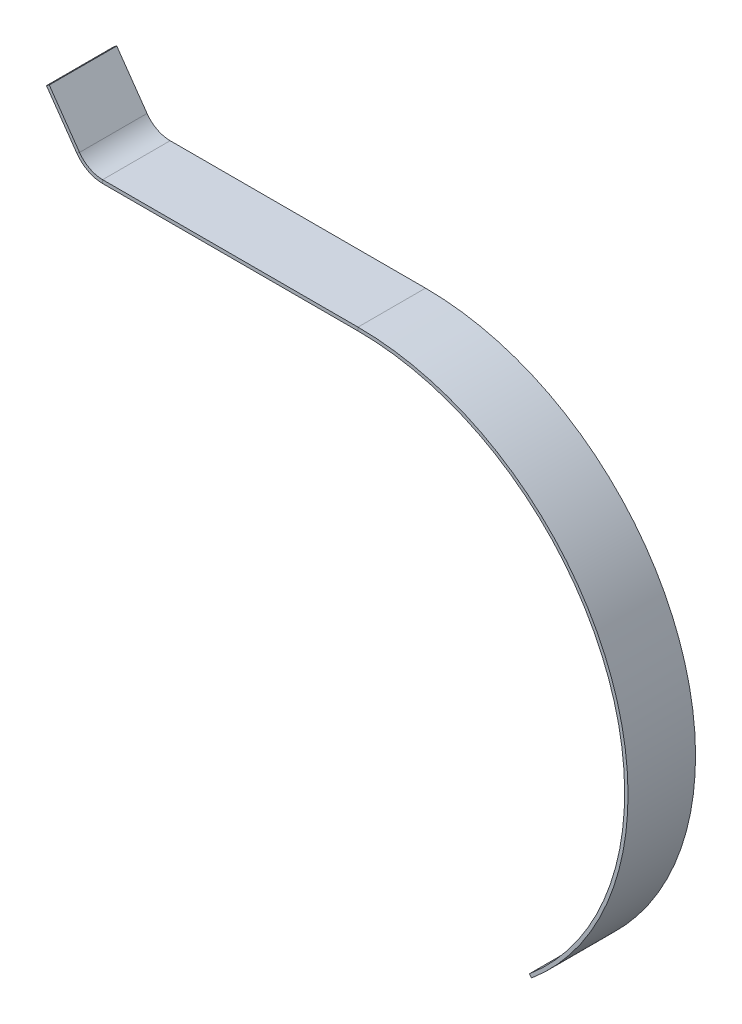
ISO-10303-21;
HEADER;
FILE_DESCRIPTION(('STEP AP214'),'2;1');
FILE_NAME('part.step','',(''),(''),'','','');
FILE_SCHEMA(('AUTOMOTIVE_DESIGN { 1 0 10303 214 1 1 1 1 }'));
ENDSEC;
DATA;
#1=APPLICATION_CONTEXT('core data for automotive mechanical design processes');
#2=APPLICATION_PROTOCOL_DEFINITION('international standard','automotive_design',2000,#1);
#3=PRODUCT_CONTEXT('',#1,'mechanical');
#4=PRODUCT('Part','Part','',(#3));
#5=PRODUCT_RELATED_PRODUCT_CATEGORY('part','',(#4));
#6=PRODUCT_DEFINITION_FORMATION('','',#4);
#7=PRODUCT_DEFINITION_CONTEXT('part definition',#1,'design');
#8=PRODUCT_DEFINITION('design','',#6,#7);
#9=PRODUCT_DEFINITION_SHAPE('','',#8);
#10=(LENGTH_UNIT() NAMED_UNIT(*) SI_UNIT(.MILLI.,.METRE.));
#11=(NAMED_UNIT(*) PLANE_ANGLE_UNIT() SI_UNIT($,.RADIAN.));
#12=(NAMED_UNIT(*) SI_UNIT($,.STERADIAN.) SOLID_ANGLE_UNIT());
#13=UNCERTAINTY_MEASURE_WITH_UNIT(LENGTH_MEASURE(1.E-05),#10,'distance_accuracy_value','');
#14=(GEOMETRIC_REPRESENTATION_CONTEXT(3) GLOBAL_UNCERTAINTY_ASSIGNED_CONTEXT((#13)) GLOBAL_UNIT_ASSIGNED_CONTEXT((#10,
#11,#12)) REPRESENTATION_CONTEXT('',''));
#15=CARTESIAN_POINT('',(0.,0.,0.));
#16=DIRECTION('',(0.,0.,1.));
#17=DIRECTION('',(1.,0.,0.));
#18=AXIS2_PLACEMENT_3D('',#15,#16,#17);
#19=CARTESIAN_POINT('',(9.14715287270209,-1.73830408857798,2.));
#20=DIRECTION('',(0.,0.,1.));
#21=DIRECTION('',(1.,0.,0.));
#22=AXIS2_PLACEMENT_3D('',#19,#20,#21);
#23=PLANE('',#22);
#24=DIRECTION('',(0.,1.,0.));
#25=VECTOR('',#24,1.);
#26=CARTESIAN_POINT('',(9.14715287270209,-1.73830408857798,2.));
#27=LINE('',#26,#25);
#28=CARTESIAN_POINT('',(9.14715287270209,-1.73830408857798,2.));
#29=VERTEX_POINT('',#28);
#30=CARTESIAN_POINT('',(9.14715287270209,-1.63830408857799,2.));
#31=VERTEX_POINT('',#30);
#32=EDGE_CURVE('E11',#29,#31,#27,.T.);
#33=ORIENTED_EDGE('',*,*,#32,.F.);
#34=CARTESIAN_POINT('',(9.14715287270209,-9.63830408857799,2.));
#35=DIRECTION('',(0.,0.,1.));
#36=DIRECTION('',(1.,0.,0.));
#37=AXIS2_PLACEMENT_3D('',#34,#35,#36);
#38=CIRCLE('',#37,7.9);
#39=CARTESIAN_POINT('',(14.2251749892257,-15.6900551892179,2.));
#40=VERTEX_POINT('',#39);
#41=EDGE_CURVE('E99',#29,#40,#38,.F.);
#42=ORIENTED_EDGE('',*,*,#41,.T.);
#43=DIRECTION('',(-0.642787609686561,0.76604444311896,0.));
#44=VECTOR('',#43,1.);
#45=CARTESIAN_POINT('',(14.2894537501944,-15.7666596335298,2.));
#46=LINE('',#45,#44);
#47=CARTESIAN_POINT('',(14.2894537501944,-15.7666596335298,2.));
#48=VERTEX_POINT('',#47);
#49=EDGE_CURVE('E430',#48,#40,#46,.T.);
#50=ORIENTED_EDGE('',*,*,#49,.F.);
#51=CARTESIAN_POINT('',(9.14715287270209,-9.63830408857799,2.));
#52=DIRECTION('',(0.,0.,-1.));
#53=DIRECTION('',(-1.,0.,0.));
#54=AXIS2_PLACEMENT_3D('',#51,#52,#53);
#55=CIRCLE('',#54,8.);
#56=EDGE_CURVE('E225',#31,#48,#55,.T.);
#57=ORIENTED_EDGE('',*,*,#56,.F.);
#58=EDGE_LOOP('',(#33,#42,#50,#57));
#59=FACE_BOUND('',#58,.T.);
#60=ADVANCED_FACE('F38',(#59),#23,.T.);
#61=CARTESIAN_POINT('',(9.14715287270209,-1.63830408857799,0.));
#62=DIRECTION('',(0.,0.,-1.));
#63=DIRECTION('',(-1.,0.,0.));
#64=AXIS2_PLACEMENT_3D('',#61,#62,#63);
#65=PLANE('',#64);
#66=DIRECTION('',(0.,-1.,0.));
#67=VECTOR('',#66,1.);
#68=CARTESIAN_POINT('',(9.14715287270209,-1.63830408857799,0.));
#69=LINE('',#68,#67);
#70=CARTESIAN_POINT('',(9.14715287270209,-1.63830408857799,0.));
#71=VERTEX_POINT('',#70);
#72=CARTESIAN_POINT('',(9.14715287270209,-1.73830408857798,0.));
#73=VERTEX_POINT('',#72);
#74=EDGE_CURVE('E46',#71,#73,#69,.T.);
#75=ORIENTED_EDGE('',*,*,#74,.F.);
#76=CARTESIAN_POINT('',(9.14715287270209,-9.63830408857799,0.));
#77=DIRECTION('',(0.,0.,-1.));
#78=DIRECTION('',(-1.,0.,0.));
#79=AXIS2_PLACEMENT_3D('',#76,#77,#78);
#80=CIRCLE('',#79,8.);
#81=CARTESIAN_POINT('',(14.2894537501944,-15.7666596335298,0.));
#82=VERTEX_POINT('',#81);
#83=EDGE_CURVE('E170',#71,#82,#80,.T.);
#84=ORIENTED_EDGE('',*,*,#83,.T.);
#85=DIRECTION('',(-0.642787609686561,0.76604444311896,0.));
#86=VECTOR('',#85,1.);
#87=CARTESIAN_POINT('',(14.2894537501944,-15.7666596335298,0.));
#88=LINE('',#87,#86);
#89=CARTESIAN_POINT('',(14.2251749892257,-15.6900551892179,0.));
#90=VERTEX_POINT('',#89);
#91=EDGE_CURVE('E167',#82,#90,#88,.T.);
#92=ORIENTED_EDGE('',*,*,#91,.T.);
#93=CARTESIAN_POINT('',(9.14715287270209,-9.63830408857799,0.));
#94=DIRECTION('',(0.,0.,1.));
#95=DIRECTION('',(1.,0.,0.));
#96=AXIS2_PLACEMENT_3D('',#93,#94,#95);
#97=CIRCLE('',#96,7.9);
#98=EDGE_CURVE('E164',#73,#90,#97,.F.);
#99=ORIENTED_EDGE('',*,*,#98,.F.);
#100=EDGE_LOOP('',(#75,#84,#92,#99));
#101=FACE_BOUND('',#100,.T.);
#102=ADVANCED_FACE('F246',(#101),#65,.T.);
#103=CARTESIAN_POINT('',(1.58265926719368,-1.63830408857799,2.));
#104=DIRECTION('',(0.,0.,1.));
#105=DIRECTION('',(1.,0.,0.));
#106=AXIS2_PLACEMENT_3D('',#103,#104,#105);
#107=PLANE('',#106);
#108=DIRECTION('',(0.,-1.,0.));
#109=VECTOR('',#108,1.);
#110=CARTESIAN_POINT('',(1.58265926719368,-1.63830408857799,2.));
#111=LINE('',#110,#109);
#112=CARTESIAN_POINT('',(1.58265926719368,-1.63830408857799,2.));
#113=VERTEX_POINT('',#112);
#114=CARTESIAN_POINT('',(1.58265926719368,-1.73830408857799,2.));
#115=VERTEX_POINT('',#114);
#116=EDGE_CURVE('E133',#113,#115,#111,.T.);
#117=ORIENTED_EDGE('',*,*,#116,.F.);
#118=CARTESIAN_POINT('',(1.58265926719368,-0.801704088577986,2.));
#119=DIRECTION('',(0.,0.,-1.));
#120=DIRECTION('',(-1.,0.,0.));
#121=AXIS2_PLACEMENT_3D('',#118,#119,#120);
#122=CIRCLE('',#121,0.8366);
#123=CARTESIAN_POINT('',(0.897356666941511,-1.28155813522927,2.));
#124=VERTEX_POINT('',#123);
#125=EDGE_CURVE('E128',#124,#113,#122,.F.);
#126=ORIENTED_EDGE('',*,*,#125,.F.);
#127=DIRECTION('',(0.819152044288993,0.573576436351045,0.));
#128=VECTOR('',#127,1.);
#129=CARTESIAN_POINT('',(0.815441462512612,-1.33891577886438,2.));
#130=LINE('',#129,#128);
#131=CARTESIAN_POINT('',(0.815441462512612,-1.33891577886438,2.));
#132=VERTEX_POINT('',#131);
#133=EDGE_CURVE('E121',#132,#124,#130,.T.);
#134=ORIENTED_EDGE('',*,*,#133,.F.);
#135=CARTESIAN_POINT('',(1.58265926719368,-0.801704088577986,2.));
#136=DIRECTION('',(0.,0.,1.));
#137=DIRECTION('',(1.,0.,0.));
#138=AXIS2_PLACEMENT_3D('',#135,#136,#137);
#139=CIRCLE('',#138,0.9366);
#140=EDGE_CURVE('E125',#132,#115,#139,.T.);
#141=ORIENTED_EDGE('',*,*,#140,.T.);
#142=EDGE_LOOP('',(#117,#126,#134,#141));
#143=FACE_BOUND('',#142,.T.);
#144=ADVANCED_FACE('F123',(#143),#107,.T.);
#145=CARTESIAN_POINT('',(0.815441462512612,-1.33891577886438,2.));
#146=DIRECTION('',(0.,0.,1.));
#147=DIRECTION('',(1.,0.,0.));
#148=AXIS2_PLACEMENT_3D('',#145,#146,#147);
#149=PLANE('',#148);
#150=DIRECTION('',(1.,0.,0.));
#151=VECTOR('',#150,1.);
#152=CARTESIAN_POINT('',(1.14715287270209,-1.63830408857799,2.));
#153=LINE('',#152,#151);
#154=EDGE_CURVE('E214',#113,#31,#153,.T.);
#155=ORIENTED_EDGE('',*,*,#154,.F.);
#156=ORIENTED_EDGE('',*,*,#116,.T.);
#157=DIRECTION('',(1.,0.,0.));
#158=VECTOR('',#157,1.);
#159=CARTESIAN_POINT('',(1.14715287270209,-1.73830408857799,2.));
#160=LINE('',#159,#158);
#161=EDGE_CURVE('E158',#115,#29,#160,.T.);
#162=ORIENTED_EDGE('',*,*,#161,.T.);
#163=ORIENTED_EDGE('',*,*,#32,.T.);
#164=EDGE_LOOP('',(#155,#156,#162,#163));
#165=FACE_BOUND('',#164,.T.);
#166=ADVANCED_FACE('F211',(#165),#149,.T.);
#167=CARTESIAN_POINT('',(0.897356666941511,-1.28155813522927,0.));
#168=DIRECTION('',(0.,0.,-1.));
#169=DIRECTION('',(-1.,0.,0.));
#170=AXIS2_PLACEMENT_3D('',#167,#168,#169);
#171=PLANE('',#170);
#172=DIRECTION('',(-0.819152044288993,-0.573576436351045,0.));
#173=VECTOR('',#172,1.);
#174=CARTESIAN_POINT('',(0.897356666941511,-1.28155813522927,0.));
#175=LINE('',#174,#173);
#176=CARTESIAN_POINT('',(0.897356666941511,-1.28155813522927,0.));
#177=VERTEX_POINT('',#176);
#178=CARTESIAN_POINT('',(0.815441462512612,-1.33891577886438,0.));
#179=VERTEX_POINT('',#178);
#180=EDGE_CURVE('E134',#177,#179,#175,.T.);
#181=ORIENTED_EDGE('',*,*,#180,.F.);
#182=CARTESIAN_POINT('',(1.58265926719368,-0.801704088577986,0.));
#183=DIRECTION('',(0.,0.,-1.));
#184=DIRECTION('',(-1.,0.,0.));
#185=AXIS2_PLACEMENT_3D('',#182,#183,#184);
#186=CIRCLE('',#185,0.8366);
#187=CARTESIAN_POINT('',(1.58265926719368,-1.63830408857799,0.));
#188=VERTEX_POINT('',#187);
#189=EDGE_CURVE('E175',#177,#188,#186,.F.);
#190=ORIENTED_EDGE('',*,*,#189,.T.);
#191=DIRECTION('',(0.,1.,0.));
#192=VECTOR('',#191,1.);
#193=CARTESIAN_POINT('',(1.58265926719368,-1.73830408857799,0.));
#194=LINE('',#193,#192);
#195=CARTESIAN_POINT('',(1.58265926719368,-1.73830408857799,0.));
#196=VERTEX_POINT('',#195);
#197=EDGE_CURVE('E87',#196,#188,#194,.T.);
#198=ORIENTED_EDGE('',*,*,#197,.F.);
#199=CARTESIAN_POINT('',(1.58265926719368,-0.801704088577986,0.));
#200=DIRECTION('',(0.,0.,1.));
#201=DIRECTION('',(1.,0.,0.));
#202=AXIS2_PLACEMENT_3D('',#199,#200,#201);
#203=CIRCLE('',#202,0.9366);
#204=EDGE_CURVE('E184',#179,#196,#203,.T.);
#205=ORIENTED_EDGE('',*,*,#204,.F.);
#206=EDGE_LOOP('',(#181,#190,#198,#205));
#207=FACE_BOUND('',#206,.T.);
#208=ADVANCED_FACE('F234',(#207),#171,.T.);
#209=CARTESIAN_POINT('',(1.58265926719368,-1.73830408857799,0.));
#210=DIRECTION('',(0.,0.,-1.));
#211=DIRECTION('',(-1.,0.,0.));
#212=AXIS2_PLACEMENT_3D('',#209,#210,#211);
#213=PLANE('',#212);
#214=DIRECTION('',(0.573576436351045,-0.819152044288993,0.));
#215=VECTOR('',#214,1.);
#216=CARTESIAN_POINT('',(0.,0.,0.));
#217=LINE('',#216,#215);
#218=CARTESIAN_POINT('',(0.,0.,0.));
#219=VERTEX_POINT('',#218);
#220=EDGE_CURVE('E177',#219,#177,#217,.T.);
#221=ORIENTED_EDGE('',*,*,#220,.T.);
#222=ORIENTED_EDGE('',*,*,#180,.T.);
#223=DIRECTION('',(0.573576436351044,-0.819152044288993,0.));
#224=VECTOR('',#223,1.);
#225=CARTESIAN_POINT('',(-0.0819152044288993,-0.0573576436351044,0.));
#226=LINE('',#225,#224);
#227=CARTESIAN_POINT('',(-0.0819152044288993,-0.0573576436351044,0.));
#228=VERTEX_POINT('',#227);
#229=EDGE_CURVE('E150',#228,#179,#226,.T.);
#230=ORIENTED_EDGE('',*,*,#229,.F.);
#231=DIRECTION('',(0.819152044288993,0.573576436351044,0.));
#232=VECTOR('',#231,1.);
#233=CARTESIAN_POINT('',(-0.0819152044288993,-0.0573576436351044,0.));
#234=LINE('',#233,#232);
#235=EDGE_CURVE('E180',#228,#219,#234,.T.);
#236=ORIENTED_EDGE('',*,*,#235,.T.);
#237=EDGE_LOOP('',(#221,#222,#230,#236));
#238=FACE_BOUND('',#237,.T.);
#239=ADVANCED_FACE('F233',(#238),#213,.T.);
#240=CARTESIAN_POINT('',(9.14715287270209,-9.63830408857799,2.));
#241=DIRECTION('',(0.,0.,-1.));
#242=DIRECTION('',(-1.,0.,0.));
#243=AXIS2_PLACEMENT_3D('',#240,#241,#242);
#244=CYLINDRICAL_SURFACE('',#243,7.9);
#245=ORIENTED_EDGE('',*,*,#98,.T.);
#246=DIRECTION('',(0.,0.,-1.));
#247=VECTOR('',#246,1.);
#248=CARTESIAN_POINT('',(14.2251749892257,-15.6900551892179,2.));
#249=LINE('',#248,#247);
#250=EDGE_CURVE('E205',#40,#90,#249,.T.);
#251=ORIENTED_EDGE('',*,*,#250,.F.);
#252=ORIENTED_EDGE('',*,*,#41,.F.);
#253=DIRECTION('',(0.,0.,-1.));
#254=VECTOR('',#253,1.);
#255=CARTESIAN_POINT('',(9.14715287270209,-1.73830408857798,2.));
#256=LINE('',#255,#254);
#257=EDGE_CURVE('E160',#29,#73,#256,.T.);
#258=ORIENTED_EDGE('',*,*,#257,.T.);
#259=EDGE_LOOP('',(#245,#251,#252,#258));
#260=FACE_BOUND('',#259,.T.);
#261=ADVANCED_FACE('F262',(#260),#244,.F.);
#262=CARTESIAN_POINT('',(14.2894537501944,-15.7666596335298,2.));
#263=DIRECTION('',(-0.76604444311896,-0.642787609686561,0.));
#264=DIRECTION('',(0.642787609686561,-0.76604444311896,0.));
#265=AXIS2_PLACEMENT_3D('',#262,#263,#264);
#266=PLANE('',#265);
#267=ORIENTED_EDGE('',*,*,#91,.F.);
#268=DIRECTION('',(0.,0.,-1.));
#269=VECTOR('',#268,1.);
#270=CARTESIAN_POINT('',(14.2894537501944,-15.7666596335298,2.));
#271=LINE('',#270,#269);
#272=EDGE_CURVE('E203',#48,#82,#271,.T.);
#273=ORIENTED_EDGE('',*,*,#272,.F.);
#274=ORIENTED_EDGE('',*,*,#49,.T.);
#275=ORIENTED_EDGE('',*,*,#250,.T.);
#276=EDGE_LOOP('',(#267,#273,#274,#275));
#277=FACE_BOUND('',#276,.T.);
#278=ADVANCED_FACE('F265',(#277),#266,.T.);
#279=CARTESIAN_POINT('',(9.14715287270209,-9.63830408857799,2.));
#280=DIRECTION('',(0.,0.,-1.));
#281=DIRECTION('',(-1.,0.,0.));
#282=AXIS2_PLACEMENT_3D('',#279,#280,#281);
#283=CYLINDRICAL_SURFACE('',#282,8.);
#284=ORIENTED_EDGE('',*,*,#83,.F.);
#285=DIRECTION('',(0.,0.,-1.));
#286=VECTOR('',#285,1.);
#287=CARTESIAN_POINT('',(9.14715287270209,-1.63830408857799,2.));
#288=LINE('',#287,#286);
#289=EDGE_CURVE('E200',#31,#71,#288,.T.);
#290=ORIENTED_EDGE('',*,*,#289,.F.);
#291=ORIENTED_EDGE('',*,*,#56,.T.);
#292=ORIENTED_EDGE('',*,*,#272,.T.);
#293=EDGE_LOOP('',(#284,#290,#291,#292));
#294=FACE_BOUND('',#293,.T.);
#295=ADVANCED_FACE('F269',(#294),#283,.T.);
#296=CARTESIAN_POINT('',(1.14715287270209,-1.63830408857799,2.));
#297=DIRECTION('',(0.,1.,0.));
#298=DIRECTION('',(-1.,0.,0.));
#299=AXIS2_PLACEMENT_3D('',#296,#297,#298);
#300=PLANE('',#299);
#301=DIRECTION('',(1.,0.,0.));
#302=VECTOR('',#301,1.);
#303=CARTESIAN_POINT('',(1.14715287270209,-1.63830408857799,0.));
#304=LINE('',#303,#302);
#305=EDGE_CURVE('E173',#188,#71,#304,.T.);
#306=ORIENTED_EDGE('',*,*,#305,.F.);
#307=DIRECTION('',(0.,0.,-1.));
#308=VECTOR('',#307,1.);
#309=CARTESIAN_POINT('',(1.58265926719368,-1.63830408857799,2.));
#310=LINE('',#309,#308);
#311=EDGE_CURVE('E197',#113,#188,#310,.T.);
#312=ORIENTED_EDGE('',*,*,#311,.F.);
#313=ORIENTED_EDGE('',*,*,#154,.T.);
#314=ORIENTED_EDGE('',*,*,#289,.T.);
#315=EDGE_LOOP('',(#306,#312,#313,#314));
#316=FACE_BOUND('',#315,.T.);
#317=ADVANCED_FACE('F218',(#316),#300,.T.);
#318=CARTESIAN_POINT('',(1.58265926719368,-0.801704088577986,2.));
#319=DIRECTION('',(0.,0.,-1.));
#320=DIRECTION('',(-1.,0.,0.));
#321=AXIS2_PLACEMENT_3D('',#318,#319,#320);
#322=CYLINDRICAL_SURFACE('',#321,0.8366);
#323=ORIENTED_EDGE('',*,*,#189,.F.);
#324=DIRECTION('',(0.,0.,-1.));
#325=VECTOR('',#324,1.);
#326=CARTESIAN_POINT('',(0.897356666941511,-1.28155813522927,2.));
#327=LINE('',#326,#325);
#328=EDGE_CURVE('E194',#124,#177,#327,.T.);
#329=ORIENTED_EDGE('',*,*,#328,.F.);
#330=ORIENTED_EDGE('',*,*,#125,.T.);
#331=ORIENTED_EDGE('',*,*,#311,.T.);
#332=EDGE_LOOP('',(#323,#329,#330,#331));
#333=FACE_BOUND('',#332,.T.);
#334=ADVANCED_FACE('F221',(#333),#322,.F.);
#335=CARTESIAN_POINT('',(0.,0.,2.));
#336=DIRECTION('',(0.819152044288993,0.573576436351045,0.));
#337=DIRECTION('',(-0.573576436351045,0.819152044288993,0.));
#338=AXIS2_PLACEMENT_3D('',#335,#336,#337);
#339=PLANE('',#338);
#340=ORIENTED_EDGE('',*,*,#220,.F.);
#341=DIRECTION('',(0.,0.,-1.));
#342=VECTOR('',#341,1.);
#343=CARTESIAN_POINT('',(0.,0.,2.));
#344=LINE('',#343,#342);
#345=CARTESIAN_POINT('',(0.,0.,2.));
#346=VERTEX_POINT('',#345);
#347=EDGE_CURVE('E192',#346,#219,#344,.T.);
#348=ORIENTED_EDGE('',*,*,#347,.F.);
#349=DIRECTION('',(0.573576436351045,-0.819152044288993,0.));
#350=VECTOR('',#349,1.);
#351=CARTESIAN_POINT('',(0.,0.,2.));
#352=LINE('',#351,#350);
#353=EDGE_CURVE('E222',#346,#124,#352,.T.);
#354=ORIENTED_EDGE('',*,*,#353,.T.);
#355=ORIENTED_EDGE('',*,*,#328,.T.);
#356=EDGE_LOOP('',(#340,#348,#354,#355));
#357=FACE_BOUND('',#356,.T.);
#358=ADVANCED_FACE('F236',(#357),#339,.T.);
#359=CARTESIAN_POINT('',(-0.0819152044288993,-0.0573576436351044,2.));
#360=DIRECTION('',(-0.573576436351044,0.819152044288993,0.));
#361=DIRECTION('',(-0.819152044288993,-0.573576436351044,0.));
#362=AXIS2_PLACEMENT_3D('',#359,#360,#361);
#363=PLANE('',#362);
#364=ORIENTED_EDGE('',*,*,#235,.F.);
#365=DIRECTION('',(0.,0.,-1.));
#366=VECTOR('',#365,1.);
#367=CARTESIAN_POINT('',(-0.0819152044288993,-0.0573576436351044,2.));
#368=LINE('',#367,#366);
#369=CARTESIAN_POINT('',(-0.0819152044288993,-0.0573576436351044,2.));
#370=VERTEX_POINT('',#369);
#371=EDGE_CURVE('E152',#370,#228,#368,.T.);
#372=ORIENTED_EDGE('',*,*,#371,.F.);
#373=DIRECTION('',(0.819152044288993,0.573576436351044,0.));
#374=VECTOR('',#373,1.);
#375=CARTESIAN_POINT('',(-0.0819152044288993,-0.0573576436351044,2.));
#376=LINE('',#375,#374);
#377=EDGE_CURVE('E142',#370,#346,#376,.T.);
#378=ORIENTED_EDGE('',*,*,#377,.T.);
#379=ORIENTED_EDGE('',*,*,#347,.T.);
#380=EDGE_LOOP('',(#364,#372,#378,#379));
#381=FACE_BOUND('',#380,.T.);
#382=ADVANCED_FACE('F230',(#381),#363,.T.);
#383=CARTESIAN_POINT('',(-0.0819152044288993,-0.0573576436351044,2.));
#384=DIRECTION('',(0.819152044288993,0.573576436351044,0.));
#385=DIRECTION('',(-0.573576436351044,0.819152044288993,0.));
#386=AXIS2_PLACEMENT_3D('',#383,#384,#385);
#387=PLANE('',#386);
#388=ORIENTED_EDGE('',*,*,#229,.T.);
#389=DIRECTION('',(0.,0.,-1.));
#390=VECTOR('',#389,1.);
#391=CARTESIAN_POINT('',(0.815441462512612,-1.33891577886438,2.));
#392=LINE('',#391,#390);
#393=EDGE_CURVE('E147',#132,#179,#392,.T.);
#394=ORIENTED_EDGE('',*,*,#393,.F.);
#395=DIRECTION('',(0.573576436351044,-0.819152044288993,0.));
#396=VECTOR('',#395,1.);
#397=CARTESIAN_POINT('',(-0.0819152044288993,-0.0573576436351044,2.));
#398=LINE('',#397,#396);
#399=EDGE_CURVE('E138',#370,#132,#398,.T.);
#400=ORIENTED_EDGE('',*,*,#399,.F.);
#401=ORIENTED_EDGE('',*,*,#371,.T.);
#402=EDGE_LOOP('',(#388,#394,#400,#401));
#403=FACE_BOUND('',#402,.T.);
#404=ADVANCED_FACE('F148',(#403),#387,.F.);
#405=CARTESIAN_POINT('',(1.58265926719368,-0.801704088577986,2.));
#406=DIRECTION('',(0.,0.,-1.));
#407=DIRECTION('',(-1.,0.,0.));
#408=AXIS2_PLACEMENT_3D('',#405,#406,#407);
#409=CYLINDRICAL_SURFACE('',#408,0.9366);
#410=ORIENTED_EDGE('',*,*,#204,.T.);
#411=DIRECTION('',(0.,0.,-1.));
#412=VECTOR('',#411,1.);
#413=CARTESIAN_POINT('',(1.58265926719368,-1.73830408857799,2.));
#414=LINE('',#413,#412);
#415=EDGE_CURVE('E153',#115,#196,#414,.T.);
#416=ORIENTED_EDGE('',*,*,#415,.F.);
#417=ORIENTED_EDGE('',*,*,#140,.F.);
#418=ORIENTED_EDGE('',*,*,#393,.T.);
#419=EDGE_LOOP('',(#410,#416,#417,#418));
#420=FACE_BOUND('',#419,.T.);
#421=ADVANCED_FACE('F155',(#420),#409,.T.);
#422=CARTESIAN_POINT('',(1.14715287270209,-1.73830408857799,2.));
#423=DIRECTION('',(0.,1.,0.));
#424=DIRECTION('',(-1.,0.,0.));
#425=AXIS2_PLACEMENT_3D('',#422,#423,#424);
#426=PLANE('',#425);
#427=DIRECTION('',(1.,0.,0.));
#428=VECTOR('',#427,1.);
#429=CARTESIAN_POINT('',(1.14715287270209,-1.73830408857799,0.));
#430=LINE('',#429,#428);
#431=EDGE_CURVE('E186',#196,#73,#430,.T.);
#432=ORIENTED_EDGE('',*,*,#431,.T.);
#433=ORIENTED_EDGE('',*,*,#257,.F.);
#434=ORIENTED_EDGE('',*,*,#161,.F.);
#435=ORIENTED_EDGE('',*,*,#415,.T.);
#436=EDGE_LOOP('',(#432,#433,#434,#435));
#437=FACE_BOUND('',#436,.T.);
#438=ADVANCED_FACE('F314',(#437),#426,.F.);
#439=CARTESIAN_POINT('',(9.14715287270209,-9.63830408857799,2.));
#440=DIRECTION('',(0.,0.,1.));
#441=DIRECTION('',(1.,0.,0.));
#442=AXIS2_PLACEMENT_3D('',#439,#440,#441);
#443=PLANE('',#442);
#444=ORIENTED_EDGE('',*,*,#399,.T.);
#445=ORIENTED_EDGE('',*,*,#133,.T.);
#446=ORIENTED_EDGE('',*,*,#353,.F.);
#447=ORIENTED_EDGE('',*,*,#377,.F.);
#448=EDGE_LOOP('',(#444,#445,#446,#447));
#449=FACE_BOUND('',#448,.T.);
#450=ADVANCED_FACE('F140',(#449),#443,.T.);
#451=CARTESIAN_POINT('',(9.14715287270209,-9.63830408857799,0.));
#452=DIRECTION('',(0.,0.,1.));
#453=DIRECTION('',(1.,0.,0.));
#454=AXIS2_PLACEMENT_3D('',#451,#452,#453);
#455=PLANE('',#454);
#456=ORIENTED_EDGE('',*,*,#305,.T.);
#457=ORIENTED_EDGE('',*,*,#74,.T.);
#458=ORIENTED_EDGE('',*,*,#431,.F.);
#459=ORIENTED_EDGE('',*,*,#197,.T.);
#460=EDGE_LOOP('',(#456,#457,#458,#459));
#461=FACE_BOUND('',#460,.T.);
#462=ADVANCED_FACE('F334',(#461),#455,.F.);
#463=CLOSED_SHELL('',(#60,#102,#144,#166,#208,#239,#261,#278,#295,#317,#334,#358,#382,#404,#421,
#438,#450,#462));
#464=MANIFOLD_SOLID_BREP('B2',#463);
#465=ADVANCED_BREP_SHAPE_REPRESENTATION('',(#18,#464),#14);
#466=SHAPE_DEFINITION_REPRESENTATION(#9,#465);
ENDSEC;
END-ISO-10303-21;
